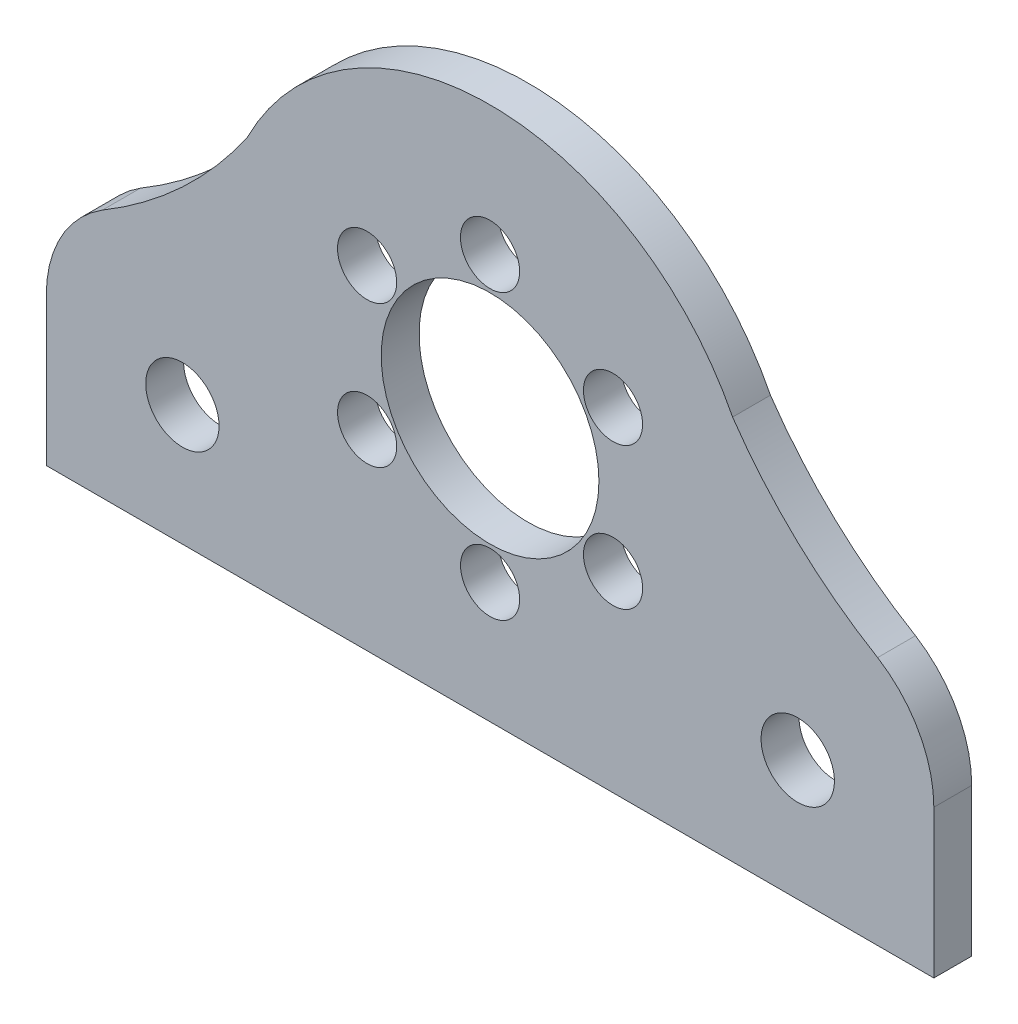
ISO-10303-21;
HEADER;
FILE_DESCRIPTION(('STEP AP214'),'2;1');
FILE_NAME('part.step','',(''),(''),'','','');
FILE_SCHEMA(('AUTOMOTIVE_DESIGN { 1 0 10303 214 1 1 1 1 }'));
ENDSEC;
DATA;
#1=APPLICATION_CONTEXT('core data for automotive mechanical design processes');
#2=APPLICATION_PROTOCOL_DEFINITION('international standard','automotive_design',2000,#1);
#3=PRODUCT_CONTEXT('',#1,'mechanical');
#4=PRODUCT('Part','Part','',(#3));
#5=PRODUCT_RELATED_PRODUCT_CATEGORY('part','',(#4));
#6=PRODUCT_DEFINITION_FORMATION('','',#4);
#7=PRODUCT_DEFINITION_CONTEXT('part definition',#1,'design');
#8=PRODUCT_DEFINITION('design','',#6,#7);
#9=PRODUCT_DEFINITION_SHAPE('','',#8);
#10=(LENGTH_UNIT() NAMED_UNIT(*) SI_UNIT(.MILLI.,.METRE.));
#11=(NAMED_UNIT(*) PLANE_ANGLE_UNIT() SI_UNIT($,.RADIAN.));
#12=(NAMED_UNIT(*) SI_UNIT($,.STERADIAN.) SOLID_ANGLE_UNIT());
#13=UNCERTAINTY_MEASURE_WITH_UNIT(LENGTH_MEASURE(1.E-05),#10,'distance_accuracy_value','');
#14=(GEOMETRIC_REPRESENTATION_CONTEXT(3) GLOBAL_UNCERTAINTY_ASSIGNED_CONTEXT((#13)) GLOBAL_UNIT_ASSIGNED_CONTEXT((#10,
#11,#12)) REPRESENTATION_CONTEXT('',''));
#15=CARTESIAN_POINT('',(0.,0.,0.));
#16=DIRECTION('',(0.,0.,1.));
#17=DIRECTION('',(1.,0.,0.));
#18=AXIS2_PLACEMENT_3D('',#15,#16,#17);
#19=CARTESIAN_POINT('',(18.75,0.,1.6));
#20=DIRECTION('',(-1.,0.,0.));
#21=DIRECTION('',(0.,-1.,0.));
#22=AXIS2_PLACEMENT_3D('',#19,#20,#21);
#23=PLANE('',#22);
#24=DIRECTION('',(0.,1.,0.));
#25=VECTOR('',#24,1.);
#26=CARTESIAN_POINT('',(18.75,0.,0.));
#27=LINE('',#26,#25);
#28=CARTESIAN_POINT('',(18.75,-11.1,0.));
#29=VERTEX_POINT('',#28);
#30=CARTESIAN_POINT('',(18.75,-4.85274711281599,0.));
#31=VERTEX_POINT('',#30);
#32=EDGE_CURVE('E177',#29,#31,#27,.T.);
#33=ORIENTED_EDGE('',*,*,#32,.T.);
#34=DIRECTION('',(0.,0.,-1.));
#35=VECTOR('',#34,1.);
#36=CARTESIAN_POINT('',(18.75,-4.85274711281599,1.6));
#37=LINE('',#36,#35);
#38=CARTESIAN_POINT('',(18.75,-4.85274711281599,1.6));
#39=VERTEX_POINT('',#38);
#40=EDGE_CURVE('E11',#39,#31,#37,.T.);
#41=ORIENTED_EDGE('',*,*,#40,.F.);
#42=DIRECTION('',(0.,1.,0.));
#43=VECTOR('',#42,1.);
#44=CARTESIAN_POINT('',(18.75,0.,1.6));
#45=LINE('',#44,#43);
#46=CARTESIAN_POINT('',(18.75,-11.1,1.6));
#47=VERTEX_POINT('',#46);
#48=EDGE_CURVE('E241',#47,#39,#45,.T.);
#49=ORIENTED_EDGE('',*,*,#48,.F.);
#50=DIRECTION('',(0.,0.,-1.));
#51=VECTOR('',#50,1.);
#52=CARTESIAN_POINT('',(18.75,-11.1,1.6));
#53=LINE('',#52,#51);
#54=EDGE_CURVE('E137',#47,#29,#53,.T.);
#55=ORIENTED_EDGE('',*,*,#54,.T.);
#56=EDGE_LOOP('',(#33,#41,#49,#55));
#57=FACE_BOUND('',#56,.T.);
#58=ADVANCED_FACE('F41',(#57),#23,.F.);
#59=CARTESIAN_POINT('',(13.686827991806,-4.85274711281598,1.6));
#60=DIRECTION('',(0.,0.,-1.));
#61=DIRECTION('',(-1.,0.,0.));
#62=AXIS2_PLACEMENT_3D('',#59,#60,#61);
#63=CYLINDRICAL_SURFACE('',#62,5.06317200819395);
#64=CARTESIAN_POINT('',(13.686827991806,-4.85274711281598,0.));
#65=DIRECTION('',(0.,0.,1.));
#66=DIRECTION('',(1.,0.,0.));
#67=AXIS2_PLACEMENT_3D('',#64,#65,#66);
#68=CIRCLE('',#67,5.06317200819395);
#69=CARTESIAN_POINT('',(16.3755062932759,-0.562441788510514,0.));
#70=VERTEX_POINT('',#69);
#71=EDGE_CURVE('E181',#31,#70,#68,.T.);
#72=ORIENTED_EDGE('',*,*,#71,.T.);
#73=DIRECTION('',(0.,0.,-1.));
#74=VECTOR('',#73,1.);
#75=CARTESIAN_POINT('',(16.3755062932759,-0.562441788510514,1.6));
#76=LINE('',#75,#74);
#77=CARTESIAN_POINT('',(16.3755062932759,-0.562441788510514,1.6));
#78=VERTEX_POINT('',#77);
#79=EDGE_CURVE('E51',#78,#70,#76,.T.);
#80=ORIENTED_EDGE('',*,*,#79,.F.);
#81=CARTESIAN_POINT('',(13.686827991806,-4.85274711281598,1.6));
#82=DIRECTION('',(0.,0.,1.));
#83=DIRECTION('',(1.,0.,0.));
#84=AXIS2_PLACEMENT_3D('',#81,#82,#83);
#85=CIRCLE('',#84,5.06317200819395);
#86=EDGE_CURVE('E98',#39,#78,#85,.T.);
#87=ORIENTED_EDGE('',*,*,#86,.F.);
#88=ORIENTED_EDGE('',*,*,#40,.T.);
#89=EDGE_LOOP('',(#72,#80,#87,#88));
#90=FACE_BOUND('',#89,.T.);
#91=ADVANCED_FACE('F322',(#90),#63,.T.);
#92=CARTESIAN_POINT('',(26.2731058799836,16.1553214426772,1.6));
#93=DIRECTION('',(0.,0.,-1.));
#94=DIRECTION('',(-1.,0.,0.));
#95=AXIS2_PLACEMENT_3D('',#92,#93,#94);
#96=CYLINDRICAL_SURFACE('',#95,19.4279717169047);
#97=CARTESIAN_POINT('',(26.2731058799836,16.1553214426772,0.));
#98=DIRECTION('',(0.,0.,1.));
#99=DIRECTION('',(1.,0.,0.));
#100=AXIS2_PLACEMENT_3D('',#97,#98,#99);
#101=CIRCLE('',#100,19.4279717169047);
#102=CARTESIAN_POINT('',(10.2472642255804,5.17267675658977,0.));
#103=VERTEX_POINT('',#102);
#104=EDGE_CURVE('E184',#70,#103,#101,.F.);
#105=ORIENTED_EDGE('',*,*,#104,.T.);
#106=DIRECTION('',(0.,0.,-1.));
#107=VECTOR('',#106,1.);
#108=CARTESIAN_POINT('',(10.2472642255804,5.17267675658977,1.6));
#109=LINE('',#108,#107);
#110=CARTESIAN_POINT('',(10.2472642255804,5.17267675658977,1.6));
#111=VERTEX_POINT('',#110);
#112=EDGE_CURVE('E212',#111,#103,#109,.T.);
#113=ORIENTED_EDGE('',*,*,#112,.F.);
#114=CARTESIAN_POINT('',(26.2731058799836,16.1553214426772,1.6));
#115=DIRECTION('',(0.,0.,1.));
#116=DIRECTION('',(1.,0.,0.));
#117=AXIS2_PLACEMENT_3D('',#114,#115,#116);
#118=CIRCLE('',#117,19.4279717169047);
#119=EDGE_CURVE('E222',#78,#111,#118,.F.);
#120=ORIENTED_EDGE('',*,*,#119,.F.);
#121=ORIENTED_EDGE('',*,*,#79,.T.);
#122=EDGE_LOOP('',(#105,#113,#120,#121));
#123=FACE_BOUND('',#122,.T.);
#124=ADVANCED_FACE('F220',(#123),#96,.F.);
#125=CARTESIAN_POINT('',(0.,0.,1.6));
#126=DIRECTION('',(0.,0.,-1.));
#127=DIRECTION('',(-1.,0.,0.));
#128=AXIS2_PLACEMENT_3D('',#125,#126,#127);
#129=CYLINDRICAL_SURFACE('',#128,11.4788069474586);
#130=CARTESIAN_POINT('',(0.,0.,0.));
#131=DIRECTION('',(0.,0.,1.));
#132=DIRECTION('',(1.,0.,0.));
#133=AXIS2_PLACEMENT_3D('',#130,#131,#132);
#134=CIRCLE('',#133,11.4788069474586);
#135=CARTESIAN_POINT('',(-10.2472642255804,5.17267675658977,0.));
#136=VERTEX_POINT('',#135);
#137=EDGE_CURVE('E187',#103,#136,#134,.T.);
#138=ORIENTED_EDGE('',*,*,#137,.T.);
#139=DIRECTION('',(0.,0.,-1.));
#140=VECTOR('',#139,1.);
#141=CARTESIAN_POINT('',(-10.2472642255804,5.17267675658977,1.6));
#142=LINE('',#141,#140);
#143=CARTESIAN_POINT('',(-10.2472642255804,5.17267675658977,1.6));
#144=VERTEX_POINT('',#143);
#145=EDGE_CURVE('E209',#144,#136,#142,.T.);
#146=ORIENTED_EDGE('',*,*,#145,.F.);
#147=CARTESIAN_POINT('',(0.,0.,1.6));
#148=DIRECTION('',(0.,0.,1.));
#149=DIRECTION('',(1.,0.,0.));
#150=AXIS2_PLACEMENT_3D('',#147,#148,#149);
#151=CIRCLE('',#150,11.4788069474586);
#152=EDGE_CURVE('E232',#111,#144,#151,.T.);
#153=ORIENTED_EDGE('',*,*,#152,.F.);
#154=ORIENTED_EDGE('',*,*,#112,.T.);
#155=EDGE_LOOP('',(#138,#146,#153,#154));
#156=FACE_BOUND('',#155,.T.);
#157=ADVANCED_FACE('F230',(#156),#129,.T.);
#158=CARTESIAN_POINT('',(-26.2731058799836,16.1553214426772,1.6));
#159=DIRECTION('',(0.,0.,-1.));
#160=DIRECTION('',(-1.,0.,0.));
#161=AXIS2_PLACEMENT_3D('',#158,#159,#160);
#162=CYLINDRICAL_SURFACE('',#161,19.4279717169047);
#163=CARTESIAN_POINT('',(-26.2731058799836,16.1553214426772,0.));
#164=DIRECTION('',(0.,0.,1.));
#165=DIRECTION('',(1.,0.,0.));
#166=AXIS2_PLACEMENT_3D('',#163,#164,#165);
#167=CIRCLE('',#166,19.4279717169047);
#168=CARTESIAN_POINT('',(-16.3755062932759,-0.562441788510506,0.));
#169=VERTEX_POINT('',#168);
#170=EDGE_CURVE('E191',#169,#136,#167,.T.);
#171=ORIENTED_EDGE('',*,*,#170,.F.);
#172=DIRECTION('',(0.,0.,-1.));
#173=VECTOR('',#172,1.);
#174=CARTESIAN_POINT('',(-16.3755062932759,-0.562441788510506,1.6));
#175=LINE('',#174,#173);
#176=CARTESIAN_POINT('',(-16.3755062932759,-0.562441788510506,1.6));
#177=VERTEX_POINT('',#176);
#178=EDGE_CURVE('E124',#177,#169,#175,.T.);
#179=ORIENTED_EDGE('',*,*,#178,.F.);
#180=CARTESIAN_POINT('',(-26.2731058799836,16.1553214426772,1.6));
#181=DIRECTION('',(0.,0.,1.));
#182=DIRECTION('',(1.,0.,0.));
#183=AXIS2_PLACEMENT_3D('',#180,#181,#182);
#184=CIRCLE('',#183,19.4279717169047);
#185=EDGE_CURVE('E130',#177,#144,#184,.T.);
#186=ORIENTED_EDGE('',*,*,#185,.T.);
#187=ORIENTED_EDGE('',*,*,#145,.T.);
#188=EDGE_LOOP('',(#171,#179,#186,#187));
#189=FACE_BOUND('',#188,.T.);
#190=ADVANCED_FACE('F333',(#189),#162,.F.);
#191=CARTESIAN_POINT('',(-13.686827991806,-4.85274711281598,1.6));
#192=DIRECTION('',(0.,0.,-1.));
#193=DIRECTION('',(-1.,0.,0.));
#194=AXIS2_PLACEMENT_3D('',#191,#192,#193);
#195=CYLINDRICAL_SURFACE('',#194,5.06317200819395);
#196=CARTESIAN_POINT('',(-13.686827991806,-4.85274711281598,0.));
#197=DIRECTION('',(0.,0.,1.));
#198=DIRECTION('',(1.,0.,0.));
#199=AXIS2_PLACEMENT_3D('',#196,#197,#198);
#200=CIRCLE('',#199,5.06317200819395);
#201=CARTESIAN_POINT('',(-18.75,-4.85274711281598,0.));
#202=VERTEX_POINT('',#201);
#203=EDGE_CURVE('E118',#202,#169,#200,.F.);
#204=ORIENTED_EDGE('',*,*,#203,.F.);
#205=DIRECTION('',(0.,0.,-1.));
#206=VECTOR('',#205,1.);
#207=CARTESIAN_POINT('',(-18.75,-4.85274711281598,1.6));
#208=LINE('',#207,#206);
#209=CARTESIAN_POINT('',(-18.75,-4.85274711281598,1.6));
#210=VERTEX_POINT('',#209);
#211=EDGE_CURVE('E113',#210,#202,#208,.T.);
#212=ORIENTED_EDGE('',*,*,#211,.F.);
#213=CARTESIAN_POINT('',(-13.686827991806,-4.85274711281598,1.6));
#214=DIRECTION('',(0.,0.,1.));
#215=DIRECTION('',(1.,0.,0.));
#216=AXIS2_PLACEMENT_3D('',#213,#214,#215);
#217=CIRCLE('',#216,5.06317200819395);
#218=EDGE_CURVE('E116',#210,#177,#217,.F.);
#219=ORIENTED_EDGE('',*,*,#218,.T.);
#220=ORIENTED_EDGE('',*,*,#178,.T.);
#221=EDGE_LOOP('',(#204,#212,#219,#220));
#222=FACE_BOUND('',#221,.T.);
#223=ADVANCED_FACE('F115',(#222),#195,.T.);
#224=CARTESIAN_POINT('',(-18.75,0.,1.6));
#225=DIRECTION('',(-1.,0.,0.));
#226=DIRECTION('',(0.,-1.,0.));
#227=AXIS2_PLACEMENT_3D('',#224,#225,#226);
#228=PLANE('',#227);
#229=DIRECTION('',(0.,1.,0.));
#230=VECTOR('',#229,1.);
#231=CARTESIAN_POINT('',(-18.75,0.,0.));
#232=LINE('',#231,#230);
#233=CARTESIAN_POINT('',(-18.75,-11.1,0.));
#234=VERTEX_POINT('',#233);
#235=EDGE_CURVE('E197',#234,#202,#232,.T.);
#236=ORIENTED_EDGE('',*,*,#235,.F.);
#237=DIRECTION('',(0.,0.,-1.));
#238=VECTOR('',#237,1.);
#239=CARTESIAN_POINT('',(-18.75,-11.1,1.6));
#240=LINE('',#239,#238);
#241=CARTESIAN_POINT('',(-18.75,-11.1,1.6));
#242=VERTEX_POINT('',#241);
#243=EDGE_CURVE('E87',#242,#234,#240,.T.);
#244=ORIENTED_EDGE('',*,*,#243,.F.);
#245=DIRECTION('',(0.,1.,0.));
#246=VECTOR('',#245,1.);
#247=CARTESIAN_POINT('',(-18.75,0.,1.6));
#248=LINE('',#247,#246);
#249=EDGE_CURVE('E128',#242,#210,#248,.T.);
#250=ORIENTED_EDGE('',*,*,#249,.T.);
#251=ORIENTED_EDGE('',*,*,#211,.T.);
#252=EDGE_LOOP('',(#236,#244,#250,#251));
#253=FACE_BOUND('',#252,.T.);
#254=ADVANCED_FACE('F133',(#253),#228,.T.);
#255=CARTESIAN_POINT('',(0.,0.,1.6));
#256=DIRECTION('',(0.,0.,-1.));
#257=DIRECTION('',(-1.,0.,0.));
#258=AXIS2_PLACEMENT_3D('',#255,#256,#257);
#259=CYLINDRICAL_SURFACE('',#258,4.6);
#260=CARTESIAN_POINT('',(0.,0.,1.6));
#261=DIRECTION('',(0.,0.,1.));
#262=DIRECTION('',(1.,0.,0.));
#263=AXIS2_PLACEMENT_3D('',#260,#261,#262);
#264=CIRCLE('',#263,4.6);
#265=CARTESIAN_POINT('',(4.6,0.,1.6));
#266=VERTEX_POINT('',#265);
#267=EDGE_CURVE('E244',#266,#266,#264,.T.);
#268=ORIENTED_EDGE('',*,*,#267,.T.);
#269=EDGE_LOOP('',(#268));
#270=FACE_BOUND('',#269,.T.);
#271=CARTESIAN_POINT('',(0.,0.,0.));
#272=DIRECTION('',(0.,0.,1.));
#273=DIRECTION('',(1.,0.,0.));
#274=AXIS2_PLACEMENT_3D('',#271,#272,#273);
#275=CIRCLE('',#274,4.6);
#276=CARTESIAN_POINT('',(4.6,0.,0.));
#277=VERTEX_POINT('',#276);
#278=EDGE_CURVE('E173',#277,#277,#275,.T.);
#279=ORIENTED_EDGE('',*,*,#278,.F.);
#280=EDGE_LOOP('',(#279));
#281=FACE_BOUND('',#280,.T.);
#282=ADVANCED_FACE('F307',(#270,#281),#259,.F.);
#283=CARTESIAN_POINT('',(-0.00119999997012094,5.99880001037141,1.6));
#284=DIRECTION('',(0.,0.,-1.));
#285=DIRECTION('',(-1.,0.,0.));
#286=AXIS2_PLACEMENT_3D('',#283,#284,#285);
#287=CYLINDRICAL_SURFACE('',#286,1.24999999706816);
#288=CARTESIAN_POINT('',(-0.00119999997012094,5.99880001037141,1.6));
#289=DIRECTION('',(0.,0.,1.));
#290=DIRECTION('',(1.,0.,0.));
#291=AXIS2_PLACEMENT_3D('',#288,#289,#290);
#292=CIRCLE('',#291,1.24999999706816);
#293=CARTESIAN_POINT('',(1.24879999709804,5.99880001037141,1.6));
#294=VERTEX_POINT('',#293);
#295=EDGE_CURVE('E248',#294,#294,#292,.T.);
#296=ORIENTED_EDGE('',*,*,#295,.T.);
#297=EDGE_LOOP('',(#296));
#298=FACE_BOUND('',#297,.T.);
#299=CARTESIAN_POINT('',(-0.00119999997012094,5.99880001037141,0.));
#300=DIRECTION('',(0.,0.,1.));
#301=DIRECTION('',(1.,0.,0.));
#302=AXIS2_PLACEMENT_3D('',#299,#300,#301);
#303=CIRCLE('',#302,1.24999999706816);
#304=CARTESIAN_POINT('',(1.24879999709804,5.99880001037141,0.));
#305=VERTEX_POINT('',#304);
#306=EDGE_CURVE('E169',#305,#305,#303,.T.);
#307=ORIENTED_EDGE('',*,*,#306,.F.);
#308=EDGE_LOOP('',(#307));
#309=FACE_BOUND('',#308,.T.);
#310=ADVANCED_FACE('F309',(#298,#309),#287,.F.);
#311=CARTESIAN_POINT('',(5.1945131922217,3.00043923092804,1.6));
#312=DIRECTION('',(0.,0.,-1.));
#313=DIRECTION('',(-1.,0.,0.));
#314=AXIS2_PLACEMENT_3D('',#311,#312,#313);
#315=CYLINDRICAL_SURFACE('',#314,1.25000000000009);
#316=CARTESIAN_POINT('',(5.1945131922217,3.00043923092804,1.6));
#317=DIRECTION('',(0.,0.,1.));
#318=DIRECTION('',(1.,0.,0.));
#319=AXIS2_PLACEMENT_3D('',#316,#317,#318);
#320=CIRCLE('',#319,1.25000000000009);
#321=CARTESIAN_POINT('',(6.44451319222179,3.00043923092804,1.6));
#322=VERTEX_POINT('',#321);
#323=EDGE_CURVE('E252',#322,#322,#320,.T.);
#324=ORIENTED_EDGE('',*,*,#323,.T.);
#325=EDGE_LOOP('',(#324));
#326=FACE_BOUND('',#325,.T.);
#327=CARTESIAN_POINT('',(5.1945131922217,3.00043923092804,0.));
#328=DIRECTION('',(0.,0.,1.));
#329=DIRECTION('',(1.,0.,0.));
#330=AXIS2_PLACEMENT_3D('',#327,#328,#329);
#331=CIRCLE('',#330,1.25000000000009);
#332=CARTESIAN_POINT('',(6.44451319222179,3.00043923092804,0.));
#333=VERTEX_POINT('',#332);
#334=EDGE_CURVE('E165',#333,#333,#331,.T.);
#335=ORIENTED_EDGE('',*,*,#334,.F.);
#336=EDGE_LOOP('',(#335));
#337=FACE_BOUND('',#336,.T.);
#338=ADVANCED_FACE('F316',(#326,#337),#315,.F.);
#339=CARTESIAN_POINT('',(5.19571319222205,-2.99836076907197,1.6));
#340=DIRECTION('',(0.,0.,-1.));
#341=DIRECTION('',(-1.,0.,0.));
#342=AXIS2_PLACEMENT_3D('',#339,#340,#341);
#343=CYLINDRICAL_SURFACE('',#342,1.25000000000043);
#344=CARTESIAN_POINT('',(5.19571319222205,-2.99836076907197,1.6));
#345=DIRECTION('',(0.,0.,1.));
#346=DIRECTION('',(1.,0.,0.));
#347=AXIS2_PLACEMENT_3D('',#344,#345,#346);
#348=CIRCLE('',#347,1.25000000000043);
#349=CARTESIAN_POINT('',(6.44571319222248,-2.99836076907197,1.6));
#350=VERTEX_POINT('',#349);
#351=EDGE_CURVE('E256',#350,#350,#348,.T.);
#352=ORIENTED_EDGE('',*,*,#351,.T.);
#353=EDGE_LOOP('',(#352));
#354=FACE_BOUND('',#353,.T.);
#355=CARTESIAN_POINT('',(5.19571319222205,-2.99836076907197,0.));
#356=DIRECTION('',(0.,0.,1.));
#357=DIRECTION('',(1.,0.,0.));
#358=AXIS2_PLACEMENT_3D('',#355,#356,#357);
#359=CIRCLE('',#358,1.25000000000043);
#360=CARTESIAN_POINT('',(6.44571319222248,-2.99836076907197,0.));
#361=VERTEX_POINT('',#360);
#362=EDGE_CURVE('E161',#361,#361,#359,.T.);
#363=ORIENTED_EDGE('',*,*,#362,.F.);
#364=EDGE_LOOP('',(#363));
#365=FACE_BOUND('',#364,.T.);
#366=ADVANCED_FACE('F397',(#354,#365),#343,.F.);
#367=CARTESIAN_POINT('',(0.00120000000012124,-5.99879999955681,1.6));
#368=DIRECTION('',(0.,0.,-1.));
#369=DIRECTION('',(-1.,0.,0.));
#370=AXIS2_PLACEMENT_3D('',#367,#368,#369);
#371=CYLINDRICAL_SURFACE('',#370,1.25000000000069);
#372=CARTESIAN_POINT('',(0.00120000000012124,-5.99879999955681,1.6));
#373=DIRECTION('',(0.,0.,1.));
#374=DIRECTION('',(1.,0.,0.));
#375=AXIS2_PLACEMENT_3D('',#372,#373,#374);
#376=CIRCLE('',#375,1.25000000000069);
#377=CARTESIAN_POINT('',(1.25120000000082,-5.99879999955681,1.6));
#378=VERTEX_POINT('',#377);
#379=EDGE_CURVE('E260',#378,#378,#376,.T.);
#380=ORIENTED_EDGE('',*,*,#379,.T.);
#381=EDGE_LOOP('',(#380));
#382=FACE_BOUND('',#381,.T.);
#383=CARTESIAN_POINT('',(0.00120000000012124,-5.99879999955681,0.));
#384=DIRECTION('',(0.,0.,1.));
#385=DIRECTION('',(1.,0.,0.));
#386=AXIS2_PLACEMENT_3D('',#383,#384,#385);
#387=CIRCLE('',#386,1.25000000000069);
#388=CARTESIAN_POINT('',(1.25120000000082,-5.99879999955681,0.));
#389=VERTEX_POINT('',#388);
#390=EDGE_CURVE('E157',#389,#389,#387,.T.);
#391=ORIENTED_EDGE('',*,*,#390,.F.);
#392=EDGE_LOOP('',(#391));
#393=FACE_BOUND('',#392,.T.);
#394=ADVANCED_FACE('F388',(#382,#393),#371,.F.);
#395=CARTESIAN_POINT('',(-5.19451319222214,-3.00043923004164,1.6));
#396=DIRECTION('',(0.,0.,-1.));
#397=DIRECTION('',(-1.,0.,0.));
#398=AXIS2_PLACEMENT_3D('',#395,#396,#397);
#399=CYLINDRICAL_SURFACE('',#398,1.25000000000063);
#400=CARTESIAN_POINT('',(-5.19451319222214,-3.00043923004164,1.6));
#401=DIRECTION('',(0.,0.,1.));
#402=DIRECTION('',(1.,0.,0.));
#403=AXIS2_PLACEMENT_3D('',#400,#401,#402);
#404=CIRCLE('',#403,1.25000000000063);
#405=CARTESIAN_POINT('',(-3.94451319222151,-3.00043923004164,1.6));
#406=VERTEX_POINT('',#405);
#407=EDGE_CURVE('E264',#406,#406,#404,.T.);
#408=ORIENTED_EDGE('',*,*,#407,.T.);
#409=EDGE_LOOP('',(#408));
#410=FACE_BOUND('',#409,.T.);
#411=CARTESIAN_POINT('',(-5.19451319222214,-3.00043923004164,0.));
#412=DIRECTION('',(0.,0.,1.));
#413=DIRECTION('',(1.,0.,0.));
#414=AXIS2_PLACEMENT_3D('',#411,#412,#413);
#415=CIRCLE('',#414,1.25000000000063);
#416=CARTESIAN_POINT('',(-3.94451319222151,-3.00043923004164,0.));
#417=VERTEX_POINT('',#416);
#418=EDGE_CURVE('E153',#417,#417,#415,.T.);
#419=ORIENTED_EDGE('',*,*,#418,.F.);
#420=EDGE_LOOP('',(#419));
#421=FACE_BOUND('',#420,.T.);
#422=ADVANCED_FACE('F379',(#410,#421),#399,.F.);
#423=CARTESIAN_POINT('',(-5.19571324784459,2.99836080206472,1.6));
#424=DIRECTION('',(0.,0.,-1.));
#425=DIRECTION('',(-1.,0.,0.));
#426=AXIS2_PLACEMENT_3D('',#423,#424,#425);
#427=CYLINDRICAL_SURFACE('',#426,1.25000000660969);
#428=CARTESIAN_POINT('',(-5.19571324784459,2.99836080206472,1.6));
#429=DIRECTION('',(0.,0.,1.));
#430=DIRECTION('',(1.,0.,0.));
#431=AXIS2_PLACEMENT_3D('',#428,#429,#430);
#432=CIRCLE('',#431,1.25000000660969);
#433=CARTESIAN_POINT('',(-3.9457132412349,2.99836080206472,1.6));
#434=VERTEX_POINT('',#433);
#435=EDGE_CURVE('E268',#434,#434,#432,.T.);
#436=ORIENTED_EDGE('',*,*,#435,.T.);
#437=EDGE_LOOP('',(#436));
#438=FACE_BOUND('',#437,.T.);
#439=CARTESIAN_POINT('',(-5.19571324784459,2.99836080206472,0.));
#440=DIRECTION('',(0.,0.,1.));
#441=DIRECTION('',(1.,0.,0.));
#442=AXIS2_PLACEMENT_3D('',#439,#440,#441);
#443=CIRCLE('',#442,1.25000000660969);
#444=CARTESIAN_POINT('',(-3.9457132412349,2.99836080206472,0.));
#445=VERTEX_POINT('',#444);
#446=EDGE_CURVE('E149',#445,#445,#443,.T.);
#447=ORIENTED_EDGE('',*,*,#446,.F.);
#448=EDGE_LOOP('',(#447));
#449=FACE_BOUND('',#448,.T.);
#450=ADVANCED_FACE('F371',(#438,#449),#427,.F.);
#451=CARTESIAN_POINT('',(13.,-6.,1.6));
#452=DIRECTION('',(0.,0.,-1.));
#453=DIRECTION('',(-1.,0.,0.));
#454=AXIS2_PLACEMENT_3D('',#451,#452,#453);
#455=CYLINDRICAL_SURFACE('',#454,1.55);
#456=CARTESIAN_POINT('',(13.,-6.,1.6));
#457=DIRECTION('',(0.,0.,1.));
#458=DIRECTION('',(1.,0.,0.));
#459=AXIS2_PLACEMENT_3D('',#456,#457,#458);
#460=CIRCLE('',#459,1.55);
#461=CARTESIAN_POINT('',(14.55,-6.,1.6));
#462=VERTEX_POINT('',#461);
#463=EDGE_CURVE('E272',#462,#462,#460,.T.);
#464=ORIENTED_EDGE('',*,*,#463,.T.);
#465=EDGE_LOOP('',(#464));
#466=FACE_BOUND('',#465,.T.);
#467=CARTESIAN_POINT('',(13.,-6.,0.));
#468=DIRECTION('',(0.,0.,1.));
#469=DIRECTION('',(1.,0.,0.));
#470=AXIS2_PLACEMENT_3D('',#467,#468,#469);
#471=CIRCLE('',#470,1.55);
#472=CARTESIAN_POINT('',(14.55,-6.,0.));
#473=VERTEX_POINT('',#472);
#474=EDGE_CURVE('E145',#473,#473,#471,.T.);
#475=ORIENTED_EDGE('',*,*,#474,.F.);
#476=EDGE_LOOP('',(#475));
#477=FACE_BOUND('',#476,.T.);
#478=ADVANCED_FACE('F285',(#466,#477),#455,.F.);
#479=CARTESIAN_POINT('',(-13.,-6.,1.6));
#480=DIRECTION('',(0.,0.,-1.));
#481=DIRECTION('',(-1.,0.,0.));
#482=AXIS2_PLACEMENT_3D('',#479,#480,#481);
#483=CYLINDRICAL_SURFACE('',#482,1.55);
#484=CARTESIAN_POINT('',(-13.,-6.,1.6));
#485=DIRECTION('',(0.,0.,1.));
#486=DIRECTION('',(1.,0.,0.));
#487=AXIS2_PLACEMENT_3D('',#484,#485,#486);
#488=CIRCLE('',#487,1.55);
#489=CARTESIAN_POINT('',(-11.45,-6.,1.6));
#490=VERTEX_POINT('',#489);
#491=EDGE_CURVE('E202',#490,#490,#488,.F.);
#492=ORIENTED_EDGE('',*,*,#491,.F.);
#493=EDGE_LOOP('',(#492));
#494=FACE_BOUND('',#493,.T.);
#495=CARTESIAN_POINT('',(-13.,-6.,0.));
#496=DIRECTION('',(0.,0.,1.));
#497=DIRECTION('',(1.,0.,0.));
#498=AXIS2_PLACEMENT_3D('',#495,#496,#497);
#499=CIRCLE('',#498,1.55);
#500=CARTESIAN_POINT('',(-11.45,-6.,0.));
#501=VERTEX_POINT('',#500);
#502=EDGE_CURVE('E141',#501,#501,#499,.F.);
#503=ORIENTED_EDGE('',*,*,#502,.T.);
#504=EDGE_LOOP('',(#503));
#505=FACE_BOUND('',#504,.T.);
#506=ADVANCED_FACE('F43',(#494,#505),#483,.F.);
#507=CARTESIAN_POINT('',(0.,-11.1,1.6));
#508=DIRECTION('',(0.,1.,0.));
#509=DIRECTION('',(0.,0.,1.));
#510=AXIS2_PLACEMENT_3D('',#507,#508,#509);
#511=PLANE('',#510);
#512=DIRECTION('',(1.,0.,0.));
#513=VECTOR('',#512,1.);
#514=CARTESIAN_POINT('',(0.,-11.1,0.));
#515=LINE('',#514,#513);
#516=EDGE_CURVE('E90',#234,#29,#515,.T.);
#517=ORIENTED_EDGE('',*,*,#516,.T.);
#518=ORIENTED_EDGE('',*,*,#54,.F.);
#519=DIRECTION('',(1.,0.,0.));
#520=VECTOR('',#519,1.);
#521=CARTESIAN_POINT('',(0.,-11.1,1.6));
#522=LINE('',#521,#520);
#523=EDGE_CURVE('E59',#242,#47,#522,.T.);
#524=ORIENTED_EDGE('',*,*,#523,.F.);
#525=ORIENTED_EDGE('',*,*,#243,.T.);
#526=EDGE_LOOP('',(#517,#518,#524,#525));
#527=FACE_BOUND('',#526,.T.);
#528=ADVANCED_FACE('F284',(#527),#511,.F.);
#529=CARTESIAN_POINT('',(0.,0.,1.6));
#530=DIRECTION('',(0.,0.,1.));
#531=DIRECTION('',(1.,0.,0.));
#532=AXIS2_PLACEMENT_3D('',#529,#530,#531);
#533=PLANE('',#532);
#534=ORIENTED_EDGE('',*,*,#491,.T.);
#535=EDGE_LOOP('',(#534));
#536=FACE_BOUND('',#535,.T.);
#537=ORIENTED_EDGE('',*,*,#463,.F.);
#538=EDGE_LOOP('',(#537));
#539=FACE_BOUND('',#538,.T.);
#540=ORIENTED_EDGE('',*,*,#435,.F.);
#541=EDGE_LOOP('',(#540));
#542=FACE_BOUND('',#541,.T.);
#543=ORIENTED_EDGE('',*,*,#407,.F.);
#544=EDGE_LOOP('',(#543));
#545=FACE_BOUND('',#544,.T.);
#546=ORIENTED_EDGE('',*,*,#379,.F.);
#547=EDGE_LOOP('',(#546));
#548=FACE_BOUND('',#547,.T.);
#549=ORIENTED_EDGE('',*,*,#351,.F.);
#550=EDGE_LOOP('',(#549));
#551=FACE_BOUND('',#550,.T.);
#552=ORIENTED_EDGE('',*,*,#323,.F.);
#553=EDGE_LOOP('',(#552));
#554=FACE_BOUND('',#553,.T.);
#555=ORIENTED_EDGE('',*,*,#295,.F.);
#556=EDGE_LOOP('',(#555));
#557=FACE_BOUND('',#556,.T.);
#558=ORIENTED_EDGE('',*,*,#267,.F.);
#559=EDGE_LOOP('',(#558));
#560=FACE_BOUND('',#559,.T.);
#561=ORIENTED_EDGE('',*,*,#48,.T.);
#562=ORIENTED_EDGE('',*,*,#86,.T.);
#563=ORIENTED_EDGE('',*,*,#119,.T.);
#564=ORIENTED_EDGE('',*,*,#152,.T.);
#565=ORIENTED_EDGE('',*,*,#185,.F.);
#566=ORIENTED_EDGE('',*,*,#218,.F.);
#567=ORIENTED_EDGE('',*,*,#249,.F.);
#568=ORIENTED_EDGE('',*,*,#523,.T.);
#569=EDGE_LOOP('',(#561,#562,#563,#564,#565,#566,#567,#568));
#570=FACE_BOUND('',#569,.T.);
#571=ADVANCED_FACE('F127',(#536,#539,#542,#545,#548,#551,#554,#557,#560,#570),#533,.T.);
#572=CARTESIAN_POINT('',(0.,0.,0.));
#573=DIRECTION('',(0.,0.,1.));
#574=DIRECTION('',(1.,0.,0.));
#575=AXIS2_PLACEMENT_3D('',#572,#573,#574);
#576=PLANE('',#575);
#577=ORIENTED_EDGE('',*,*,#502,.F.);
#578=EDGE_LOOP('',(#577));
#579=FACE_BOUND('',#578,.T.);
#580=ORIENTED_EDGE('',*,*,#474,.T.);
#581=EDGE_LOOP('',(#580));
#582=FACE_BOUND('',#581,.T.);
#583=ORIENTED_EDGE('',*,*,#446,.T.);
#584=EDGE_LOOP('',(#583));
#585=FACE_BOUND('',#584,.T.);
#586=ORIENTED_EDGE('',*,*,#418,.T.);
#587=EDGE_LOOP('',(#586));
#588=FACE_BOUND('',#587,.T.);
#589=ORIENTED_EDGE('',*,*,#390,.T.);
#590=EDGE_LOOP('',(#589));
#591=FACE_BOUND('',#590,.T.);
#592=ORIENTED_EDGE('',*,*,#362,.T.);
#593=EDGE_LOOP('',(#592));
#594=FACE_BOUND('',#593,.T.);
#595=ORIENTED_EDGE('',*,*,#334,.T.);
#596=EDGE_LOOP('',(#595));
#597=FACE_BOUND('',#596,.T.);
#598=ORIENTED_EDGE('',*,*,#306,.T.);
#599=EDGE_LOOP('',(#598));
#600=FACE_BOUND('',#599,.T.);
#601=ORIENTED_EDGE('',*,*,#278,.T.);
#602=EDGE_LOOP('',(#601));
#603=FACE_BOUND('',#602,.T.);
#604=ORIENTED_EDGE('',*,*,#32,.F.);
#605=ORIENTED_EDGE('',*,*,#516,.F.);
#606=ORIENTED_EDGE('',*,*,#235,.T.);
#607=ORIENTED_EDGE('',*,*,#203,.T.);
#608=ORIENTED_EDGE('',*,*,#170,.T.);
#609=ORIENTED_EDGE('',*,*,#137,.F.);
#610=ORIENTED_EDGE('',*,*,#104,.F.);
#611=ORIENTED_EDGE('',*,*,#71,.F.);
#612=EDGE_LOOP('',(#604,#605,#606,#607,#608,#609,#610,#611));
#613=FACE_BOUND('',#612,.T.);
#614=ADVANCED_FACE('F226',(#579,#582,#585,#588,#591,#594,#597,#600,#603,#613),#576,.F.);
#615=CLOSED_SHELL('',(#58,#91,#124,#157,#190,#223,#254,#282,#310,#338,#366,#394,#422,#450,#478,
#506,#528,#571,#614));
#616=MANIFOLD_SOLID_BREP('B2',#615);
#617=ADVANCED_BREP_SHAPE_REPRESENTATION('',(#18,#616),#14);
#618=SHAPE_DEFINITION_REPRESENTATION(#9,#617);
ENDSEC;
END-ISO-10303-21;
